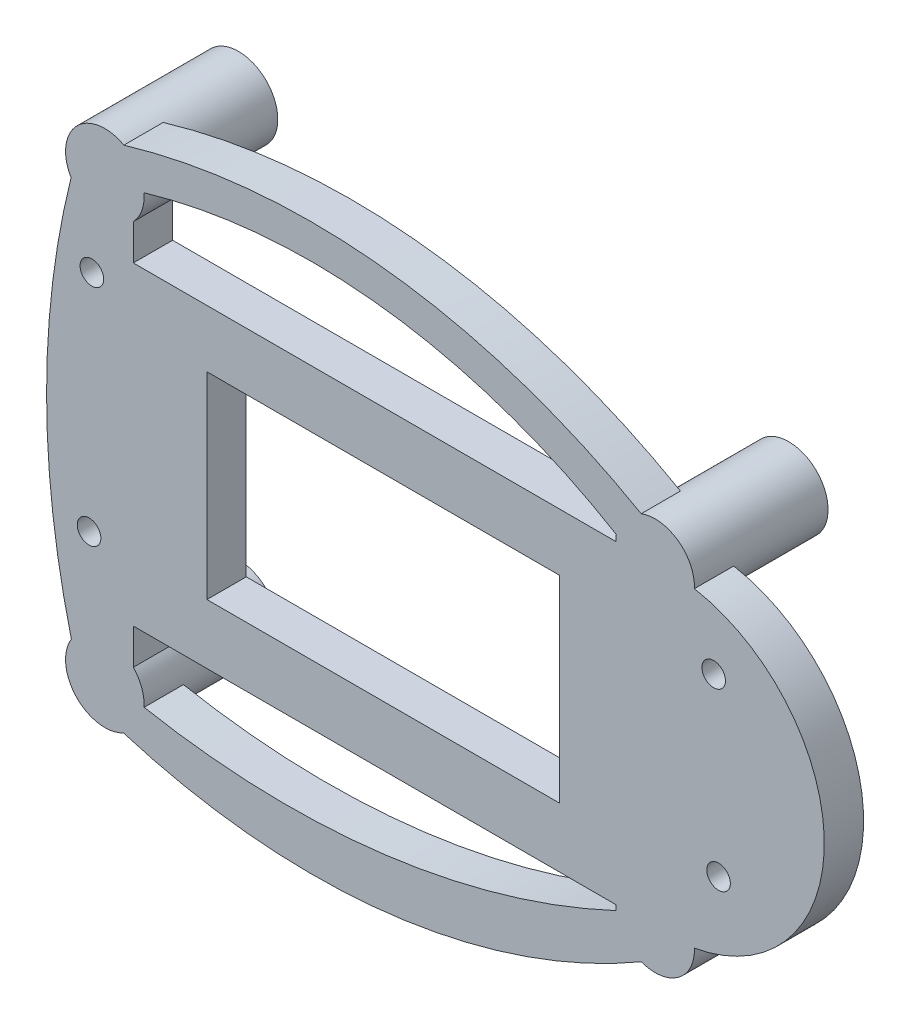
ISO-10303-21;
HEADER;
FILE_DESCRIPTION(('STEP AP214'),'2;1');
FILE_NAME('part.step','',(''),(''),'','','');
FILE_SCHEMA(('AUTOMOTIVE_DESIGN { 1 0 10303 214 1 1 1 1 }'));
ENDSEC;
DATA;
#1=APPLICATION_CONTEXT('core data for automotive mechanical design processes');
#2=APPLICATION_PROTOCOL_DEFINITION('international standard','automotive_design',2000,#1);
#3=PRODUCT_CONTEXT('',#1,'mechanical');
#4=PRODUCT('Part','Part','',(#3));
#5=PRODUCT_RELATED_PRODUCT_CATEGORY('part','',(#4));
#6=PRODUCT_DEFINITION_FORMATION('','',#4);
#7=PRODUCT_DEFINITION_CONTEXT('part definition',#1,'design');
#8=PRODUCT_DEFINITION('design','',#6,#7);
#9=PRODUCT_DEFINITION_SHAPE('','',#8);
#10=(LENGTH_UNIT() NAMED_UNIT(*) SI_UNIT(.MILLI.,.METRE.));
#11=(NAMED_UNIT(*) PLANE_ANGLE_UNIT() SI_UNIT($,.RADIAN.));
#12=(NAMED_UNIT(*) SI_UNIT($,.STERADIAN.) SOLID_ANGLE_UNIT());
#13=UNCERTAINTY_MEASURE_WITH_UNIT(LENGTH_MEASURE(1.E-05),#10,'distance_accuracy_value','');
#14=(GEOMETRIC_REPRESENTATION_CONTEXT(3) GLOBAL_UNCERTAINTY_ASSIGNED_CONTEXT((#13)) GLOBAL_UNIT_ASSIGNED_CONTEXT((#10,
#11,#12)) REPRESENTATION_CONTEXT('',''));
#15=CARTESIAN_POINT('',(0.,0.,0.));
#16=DIRECTION('',(0.,0.,1.));
#17=DIRECTION('',(1.,0.,0.));
#18=AXIS2_PLACEMENT_3D('',#15,#16,#17);
#19=CARTESIAN_POINT('',(-83.512307698448,-22.3019799287545,5.));
#20=DIRECTION('',(0.,0.,-1.));
#21=DIRECTION('',(-1.,0.,0.));
#22=AXIS2_PLACEMENT_3D('',#19,#20,#21);
#23=CYLINDRICAL_SURFACE('',#22,2.59999999999999);
#24=CARTESIAN_POINT('',(-83.512307698448,-22.3019799287545,-12.));
#25=DIRECTION('',(0.,0.,-1.));
#26=DIRECTION('',(-1.,0.,0.));
#27=AXIS2_PLACEMENT_3D('',#24,#25,#26);
#28=CIRCLE('',#27,2.59999999999999);
#29=CARTESIAN_POINT('',(-86.112307698448,-22.3019799287545,-12.));
#30=VERTEX_POINT('',#29);
#31=EDGE_CURVE('E238',#30,#30,#28,.T.);
#32=ORIENTED_EDGE('',*,*,#31,.T.);
#33=EDGE_LOOP('',(#32));
#34=FACE_BOUND('',#33,.T.);
#35=CARTESIAN_POINT('',(-83.512307698448,-22.3019799287545,-4.99999999999999));
#36=DIRECTION('',(0.,0.,1.));
#37=DIRECTION('',(1.,0.,0.));
#38=AXIS2_PLACEMENT_3D('',#35,#36,#37);
#39=CIRCLE('',#38,2.59999999999999);
#40=CARTESIAN_POINT('',(-80.912307698448,-22.3019799287545,-4.99999999999999));
#41=VERTEX_POINT('',#40);
#42=EDGE_CURVE('E587',#41,#41,#39,.T.);
#43=ORIENTED_EDGE('',*,*,#42,.T.);
#44=EDGE_LOOP('',(#43));
#45=FACE_BOUND('',#44,.T.);
#46=ADVANCED_FACE('F42',(#34,#45),#23,.F.);
#47=CARTESIAN_POINT('',(-13.512307698448,-14.3019799287545,5.));
#48=DIRECTION('',(0.,0.,-1.));
#49=DIRECTION('',(-1.,0.,0.));
#50=AXIS2_PLACEMENT_3D('',#47,#48,#49);
#51=CYLINDRICAL_SURFACE('',#50,2.6);
#52=CARTESIAN_POINT('',(-13.512307698448,-14.3019799287545,-12.));
#53=DIRECTION('',(0.,0.,-1.));
#54=DIRECTION('',(-1.,0.,0.));
#55=AXIS2_PLACEMENT_3D('',#52,#53,#54);
#56=CIRCLE('',#55,2.6);
#57=CARTESIAN_POINT('',(-16.112307698448,-14.3019799287545,-12.));
#58=VERTEX_POINT('',#57);
#59=EDGE_CURVE('E506',#58,#58,#56,.T.);
#60=ORIENTED_EDGE('',*,*,#59,.T.);
#61=EDGE_LOOP('',(#60));
#62=FACE_BOUND('',#61,.T.);
#63=CARTESIAN_POINT('',(-13.512307698448,-14.3019799287545,-4.99999999999999));
#64=DIRECTION('',(0.,0.,1.));
#65=DIRECTION('',(1.,0.,0.));
#66=AXIS2_PLACEMENT_3D('',#63,#64,#65);
#67=CIRCLE('',#66,2.6);
#68=CARTESIAN_POINT('',(-10.912307698448,-14.3019799287545,-4.99999999999999));
#69=VERTEX_POINT('',#68);
#70=EDGE_CURVE('E500',#69,#69,#67,.T.);
#71=ORIENTED_EDGE('',*,*,#70,.T.);
#72=EDGE_LOOP('',(#71));
#73=FACE_BOUND('',#72,.T.);
#74=ADVANCED_FACE('F611',(#62,#73),#51,.F.);
#75=CARTESIAN_POINT('',(-13.512307698448,25.6980200712455,5.));
#76=DIRECTION('',(0.,0.,-1.));
#77=DIRECTION('',(-1.,0.,0.));
#78=AXIS2_PLACEMENT_3D('',#75,#76,#77);
#79=CYLINDRICAL_SURFACE('',#78,2.6);
#80=CARTESIAN_POINT('',(-13.512307698448,25.6980200712455,-12.));
#81=DIRECTION('',(0.,0.,-1.));
#82=DIRECTION('',(-1.,0.,0.));
#83=AXIS2_PLACEMENT_3D('',#80,#81,#82);
#84=CIRCLE('',#83,2.6);
#85=CARTESIAN_POINT('',(-16.112307698448,25.6980200712455,-12.));
#86=VERTEX_POINT('',#85);
#87=EDGE_CURVE('E292',#86,#86,#84,.T.);
#88=ORIENTED_EDGE('',*,*,#87,.T.);
#89=EDGE_LOOP('',(#88));
#90=FACE_BOUND('',#89,.T.);
#91=CARTESIAN_POINT('',(-13.512307698448,25.6980200712455,-4.99999999999999));
#92=DIRECTION('',(0.,0.,1.));
#93=DIRECTION('',(1.,0.,0.));
#94=AXIS2_PLACEMENT_3D('',#91,#92,#93);
#95=CIRCLE('',#94,2.6);
#96=CARTESIAN_POINT('',(-10.912307698448,25.6980200712455,-4.99999999999999));
#97=VERTEX_POINT('',#96);
#98=EDGE_CURVE('E495',#97,#97,#95,.T.);
#99=ORIENTED_EDGE('',*,*,#98,.T.);
#100=EDGE_LOOP('',(#99));
#101=FACE_BOUND('',#100,.T.);
#102=ADVANCED_FACE('F617',(#90,#101),#79,.F.);
#103=CARTESIAN_POINT('',(-83.512307698448,33.6980200712455,5.));
#104=DIRECTION('',(0.,0.,-1.));
#105=DIRECTION('',(-1.,0.,0.));
#106=AXIS2_PLACEMENT_3D('',#103,#104,#105);
#107=CYLINDRICAL_SURFACE('',#106,2.59999999999999);
#108=CARTESIAN_POINT('',(-83.512307698448,33.6980200712455,-12.));
#109=DIRECTION('',(0.,0.,-1.));
#110=DIRECTION('',(-1.,0.,0.));
#111=AXIS2_PLACEMENT_3D('',#108,#109,#110);
#112=CIRCLE('',#111,2.59999999999999);
#113=CARTESIAN_POINT('',(-86.112307698448,33.6980200712455,-12.));
#114=VERTEX_POINT('',#113);
#115=EDGE_CURVE('E265',#114,#114,#112,.T.);
#116=ORIENTED_EDGE('',*,*,#115,.T.);
#117=EDGE_LOOP('',(#116));
#118=FACE_BOUND('',#117,.T.);
#119=CARTESIAN_POINT('',(-83.512307698448,33.6980200712455,-4.99999999999999));
#120=DIRECTION('',(0.,0.,1.));
#121=DIRECTION('',(1.,0.,0.));
#122=AXIS2_PLACEMENT_3D('',#119,#120,#121);
#123=CIRCLE('',#122,2.59999999999999);
#124=CARTESIAN_POINT('',(-80.912307698448,33.6980200712455,-4.99999999999999));
#125=VERTEX_POINT('',#124);
#126=EDGE_CURVE('E499',#125,#125,#123,.T.);
#127=ORIENTED_EDGE('',*,*,#126,.T.);
#128=EDGE_LOOP('',(#127));
#129=FACE_BOUND('',#128,.T.);
#130=ADVANCED_FACE('F622',(#118,#129),#107,.F.);
#131=CARTESIAN_POINT('',(-35.2783930265433,19.0750178271351,0.));
#132=DIRECTION('',(0.,0.,1.));
#133=DIRECTION('',(1.,0.,0.));
#134=AXIS2_PLACEMENT_3D('',#131,#132,#133);
#135=PLANE('',#134);
#136=CARTESIAN_POINT('',(-5.44529677776043,-4.69111653885912,0.));
#137=DIRECTION('',(0.,0.,1.));
#138=DIRECTION('',(1.,0.,0.));
#139=AXIS2_PLACEMENT_3D('',#136,#137,#138);
#140=CIRCLE('',#139,1.5);
#141=CARTESIAN_POINT('',(-3.94529677776043,-4.69111653885912,0.));
#142=VERTEX_POINT('',#141);
#143=EDGE_CURVE('E321',#142,#142,#140,.T.);
#144=ORIENTED_EDGE('',*,*,#143,.T.);
#145=EDGE_LOOP('',(#144));
#146=FACE_BOUND('',#145,.T.);
#147=CARTESIAN_POINT('',(-6.06421034522032,17.3148884735476,0.));
#148=DIRECTION('',(0.,0.,1.));
#149=DIRECTION('',(1.,0.,0.));
#150=AXIS2_PLACEMENT_3D('',#147,#148,#149);
#151=CIRCLE('',#150,1.5);
#152=CARTESIAN_POINT('',(-4.56421034522031,17.3148884735476,0.));
#153=VERTEX_POINT('',#152);
#154=EDGE_CURVE('E326',#153,#153,#151,.T.);
#155=ORIENTED_EDGE('',*,*,#154,.T.);
#156=EDGE_LOOP('',(#155));
#157=FACE_BOUND('',#156,.T.);
#158=CARTESIAN_POINT('',(-85.5239357137409,-6.70274455415199,0.));
#159=DIRECTION('',(0.,0.,1.));
#160=DIRECTION('',(1.,0.,0.));
#161=AXIS2_PLACEMENT_3D('',#158,#159,#160);
#162=CIRCLE('',#161,1.5);
#163=CARTESIAN_POINT('',(-84.0239357137409,-6.70274455415199,0.));
#164=VERTEX_POINT('',#163);
#165=EDGE_CURVE('E334',#164,#164,#162,.T.);
#166=ORIENTED_EDGE('',*,*,#165,.T.);
#167=EDGE_LOOP('',(#166));
#168=FACE_BOUND('',#167,.T.);
#169=CARTESIAN_POINT('',(-85.167222680251,22.0113146997251,0.));
#170=DIRECTION('',(0.,0.,1.));
#171=DIRECTION('',(1.,0.,0.));
#172=AXIS2_PLACEMENT_3D('',#169,#170,#171);
#173=CIRCLE('',#172,1.5);
#174=CARTESIAN_POINT('',(-83.667222680251,22.0113146997251,0.));
#175=VERTEX_POINT('',#174);
#176=EDGE_CURVE('E342',#175,#175,#173,.T.);
#177=ORIENTED_EDGE('',*,*,#176,.T.);
#178=EDGE_LOOP('',(#177));
#179=FACE_BOUND('',#178,.T.);
#180=DIRECTION('',(0.,-1.,0.));
#181=VECTOR('',#180,1.);
#182=CARTESIAN_POINT('',(-70.5265622200321,18.3949105439373,0.));
#183=LINE('',#182,#181);
#184=CARTESIAN_POINT('',(-70.5265622200321,18.3949105439373,0.));
#185=VERTEX_POINT('',#184);
#186=CARTESIAN_POINT('',(-70.5265622200321,-6.70274455415199,0.));
#187=VERTEX_POINT('',#186);
#188=EDGE_CURVE('E350',#185,#187,#183,.T.);
#189=ORIENTED_EDGE('',*,*,#188,.T.);
#190=DIRECTION('',(1.,0.,0.));
#191=VECTOR('',#190,1.);
#192=CARTESIAN_POINT('',(-70.5265622200321,-6.70274455415199,0.));
#193=LINE('',#192,#191);
#194=CARTESIAN_POINT('',(-25.7093209734441,-6.70274455415199,0.));
#195=VERTEX_POINT('',#194);
#196=EDGE_CURVE('E372',#187,#195,#193,.T.);
#197=ORIENTED_EDGE('',*,*,#196,.T.);
#198=DIRECTION('',(0.,1.,0.));
#199=VECTOR('',#198,1.);
#200=CARTESIAN_POINT('',(-25.7093209734441,18.3949105439373,0.));
#201=LINE('',#200,#199);
#202=CARTESIAN_POINT('',(-25.7093209734441,18.3949105439373,0.));
#203=VERTEX_POINT('',#202);
#204=EDGE_CURVE('E376',#195,#203,#201,.T.);
#205=ORIENTED_EDGE('',*,*,#204,.T.);
#206=DIRECTION('',(-1.,0.,0.));
#207=VECTOR('',#206,1.);
#208=CARTESIAN_POINT('',(-70.5265622200321,18.3949105439373,0.));
#209=LINE('',#208,#207);
#210=EDGE_CURVE('E358',#203,#185,#209,.T.);
#211=ORIENTED_EDGE('',*,*,#210,.T.);
#212=EDGE_LOOP('',(#189,#197,#205,#211));
#213=FACE_BOUND('',#212,.T.);
#214=CARTESIAN_POINT('',(-12.1154649233969,5.69802007124552,0.));
#215=DIRECTION('',(0.,0.,1.));
#216=DIRECTION('',(-1.,0.,0.));
#217=AXIS2_PLACEMENT_3D('',#214,#215,#216);
#218=CIRCLE('',#217,20.1231241484578);
#219=CARTESIAN_POINT('',(-8.51636347232125,-14.1006312524964,0.));
#220=VERTEX_POINT('',#219);
#221=CARTESIAN_POINT('',(-8.51636347232126,25.4966713949875,0.));
#222=VERTEX_POINT('',#221);
#223=EDGE_CURVE('E454',#220,#222,#218,.T.);
#224=ORIENTED_EDGE('',*,*,#223,.F.);
#225=CARTESIAN_POINT('',(-13.512307698448,-14.3019799287545,0.));
#226=DIRECTION('',(0.,0.,1.));
#227=DIRECTION('',(1.,0.,0.));
#228=AXIS2_PLACEMENT_3D('',#225,#226,#227);
#229=CIRCLE('',#228,5.);
#230=CARTESIAN_POINT('',(-18.512307698448,-14.3019803280735,0.));
#231=VERTEX_POINT('',#230);
#232=EDGE_CURVE('E218',#220,#231,#229,.T.);
#233=ORIENTED_EDGE('',*,*,#232,.T.);
#234=DIRECTION('',(-1.,0.,0.));
#235=VECTOR('',#234,1.);
#236=CARTESIAN_POINT('',(-79.8928256152222,-14.3019803280735,0.));
#237=LINE('',#236,#235);
#238=CARTESIAN_POINT('',(-79.8928256152222,-14.3019803280735,0.));
#239=VERTEX_POINT('',#238);
#240=EDGE_CURVE('E211',#231,#239,#237,.T.);
#241=ORIENTED_EDGE('',*,*,#240,.T.);
#242=DIRECTION('',(0.,-1.,0.));
#243=VECTOR('',#242,1.);
#244=CARTESIAN_POINT('',(-79.8928256152222,-14.3019803280735,0.));
#245=LINE('',#244,#243);
#246=CARTESIAN_POINT('',(-79.8928256152222,-18.8524365605378,0.));
#247=VERTEX_POINT('',#246);
#248=EDGE_CURVE('E422',#239,#247,#245,.T.);
#249=ORIENTED_EDGE('',*,*,#248,.T.);
#250=CARTESIAN_POINT('',(-83.512307698448,-22.3019799287545,0.));
#251=DIRECTION('',(0.,0.,1.));
#252=DIRECTION('',(1.,0.,0.));
#253=AXIS2_PLACEMENT_3D('',#250,#251,#252);
#254=CIRCLE('',#253,5.);
#255=CARTESIAN_POINT('',(-87.7725236195829,-19.6846224244559,0.));
#256=VERTEX_POINT('',#255);
#257=EDGE_CURVE('E251',#247,#256,#254,.T.);
#258=ORIENTED_EDGE('',*,*,#257,.T.);
#259=CARTESIAN_POINT('',(13.5483236221643,5.79442415203338,0.));
#260=DIRECTION('',(0.,0.,1.));
#261=DIRECTION('',(1.,0.,0.));
#262=AXIS2_PLACEMENT_3D('',#259,#260,#261);
#263=CIRCLE('',#262,104.47533632505);
#264=CARTESIAN_POINT('',(-87.8067094238595,31.1371386173743,0.));
#265=VERTEX_POINT('',#264);
#266=EDGE_CURVE('E441',#265,#256,#263,.T.);
#267=ORIENTED_EDGE('',*,*,#266,.F.);
#268=CARTESIAN_POINT('',(-83.512307698448,33.6980200712455,0.));
#269=DIRECTION('',(0.,0.,1.));
#270=DIRECTION('',(1.,0.,0.));
#271=AXIS2_PLACEMENT_3D('',#268,#269,#270);
#272=CIRCLE('',#271,5.00000000000001);
#273=CARTESIAN_POINT('',(-79.8928256152222,30.2484767030289,0.));
#274=VERTEX_POINT('',#273);
#275=EDGE_CURVE('E278',#265,#274,#272,.T.);
#276=ORIENTED_EDGE('',*,*,#275,.T.);
#277=DIRECTION('',(0.,-1.,0.));
#278=VECTOR('',#277,1.);
#279=CARTESIAN_POINT('',(-79.8928256152222,33.6980198675562,0.));
#280=LINE('',#279,#278);
#281=CARTESIAN_POINT('',(-79.8928256152222,25.6980200712455,0.));
#282=VERTEX_POINT('',#281);
#283=EDGE_CURVE('E411',#274,#282,#280,.T.);
#284=ORIENTED_EDGE('',*,*,#283,.T.);
#285=DIRECTION('',(1.,0.,0.));
#286=VECTOR('',#285,1.);
#287=CARTESIAN_POINT('',(-79.8928256152222,25.6980200712455,0.));
#288=LINE('',#287,#286);
#289=CARTESIAN_POINT('',(-18.512307698448,25.6980200712455,0.));
#290=VERTEX_POINT('',#289);
#291=EDGE_CURVE('E401',#282,#290,#288,.T.);
#292=ORIENTED_EDGE('',*,*,#291,.T.);
#293=CARTESIAN_POINT('',(-13.512307698448,25.6980200712455,0.));
#294=DIRECTION('',(0.,0.,1.));
#295=DIRECTION('',(1.,0.,0.));
#296=AXIS2_PLACEMENT_3D('',#293,#294,#295);
#297=CIRCLE('',#296,5.);
#298=EDGE_CURVE('E305',#290,#222,#297,.T.);
#299=ORIENTED_EDGE('',*,*,#298,.T.);
#300=EDGE_LOOP('',(#224,#233,#241,#249,#258,#267,#276,#284,#292,#299));
#301=FACE_BOUND('',#300,.T.);
#302=ADVANCED_FACE('F630',(#146,#157,#168,#179,#213,#301),#135,.F.);
#303=CARTESIAN_POINT('',(-57.1828732053487,-38.3236908219769,0.));
#304=DIRECTION('',(0.,0.,1.));
#305=DIRECTION('',(-1.,0.,0.));
#306=AXIS2_PLACEMENT_3D('',#303,#304,#305);
#307=CIRCLE('',#306,75.5173407179141);
#308=CARTESIAN_POINT('',(-18.4471890489969,26.5023496405169,0.));
#309=VERTEX_POINT('',#308);
#310=CARTESIAN_POINT('',(-78.5296220934509,34.1137653800035,0.));
#311=VERTEX_POINT('',#310);
#312=EDGE_CURVE('E396',#309,#311,#307,.T.);
#313=ORIENTED_EDGE('',*,*,#312,.T.);
#314=CARTESIAN_POINT('',(-81.0963866501547,38.075613644022,0.));
#315=VERTEX_POINT('',#314);
#316=EDGE_CURVE('E282',#311,#315,#272,.T.);
#317=ORIENTED_EDGE('',*,*,#316,.T.);
#318=CARTESIAN_POINT('',(-57.1669271877249,-42.410418712094,0.));
#319=DIRECTION('',(0.,0.,1.));
#320=DIRECTION('',(1.,0.,0.));
#321=AXIS2_PLACEMENT_3D('',#318,#319,#320);
#322=CIRCLE('',#321,83.9679726716908);
#323=CARTESIAN_POINT('',(-15.2917196693426,30.3706738180833,0.));
#324=VERTEX_POINT('',#323);
#325=EDGE_CURVE('E457',#324,#315,#322,.T.);
#326=ORIENTED_EDGE('',*,*,#325,.F.);
#327=EDGE_CURVE('E310',#324,#309,#297,.T.);
#328=ORIENTED_EDGE('',*,*,#327,.T.);
#329=EDGE_LOOP('',(#313,#317,#326,#328));
#330=FACE_BOUND('',#329,.T.);
#331=ADVANCED_FACE('F627',(#330),#135,.F.);
#332=CARTESIAN_POINT('',(-35.2783930265433,19.0750178271351,5.));
#333=DIRECTION('',(0.,0.,1.));
#334=DIRECTION('',(1.,0.,0.));
#335=AXIS2_PLACEMENT_3D('',#332,#333,#334);
#336=PLANE('',#335);
#337=DIRECTION('',(-1.,0.,0.));
#338=VECTOR('',#337,1.);
#339=CARTESIAN_POINT('',(-79.8928256152222,-14.3019803280735,5.));
#340=LINE('',#339,#338);
#341=CARTESIAN_POINT('',(-18.512307698448,-14.3019803280735,5.));
#342=VERTEX_POINT('',#341);
#343=CARTESIAN_POINT('',(-79.8928256152222,-14.3019803280735,5.));
#344=VERTEX_POINT('',#343);
#345=EDGE_CURVE('E194',#342,#344,#340,.T.);
#346=ORIENTED_EDGE('',*,*,#345,.F.);
#347=CARTESIAN_POINT('',(-13.512307698448,-14.3019799287545,5.));
#348=DIRECTION('',(0.,0.,1.));
#349=DIRECTION('',(1.,0.,0.));
#350=AXIS2_PLACEMENT_3D('',#347,#348,#349);
#351=CIRCLE('',#350,5.);
#352=CARTESIAN_POINT('',(-18.4709602588486,-14.9436689385034,5.));
#353=VERTEX_POINT('',#352);
#354=EDGE_CURVE('E200',#353,#342,#351,.F.);
#355=ORIENTED_EDGE('',*,*,#354,.F.);
#356=CARTESIAN_POINT('',(-60.2818658125429,74.0317317983794,5.));
#357=DIRECTION('',(0.,0.,1.));
#358=DIRECTION('',(1.,0.,0.));
#359=AXIS2_PLACEMENT_3D('',#356,#357,#358);
#360=CIRCLE('',#359,98.309581219273);
#361=CARTESIAN_POINT('',(-78.5195702466896,-22.5713732059709,5.));
#362=VERTEX_POINT('',#361);
#363=EDGE_CURVE('E207',#362,#353,#360,.T.);
#364=ORIENTED_EDGE('',*,*,#363,.F.);
#365=CARTESIAN_POINT('',(-83.512307698448,-22.3019799287545,5.));
#366=DIRECTION('',(0.,0.,1.));
#367=DIRECTION('',(1.,0.,0.));
#368=AXIS2_PLACEMENT_3D('',#365,#366,#367);
#369=CIRCLE('',#368,5.);
#370=CARTESIAN_POINT('',(-79.8928256152222,-18.8524365605378,5.));
#371=VERTEX_POINT('',#370);
#372=EDGE_CURVE('E246',#371,#362,#369,.F.);
#373=ORIENTED_EDGE('',*,*,#372,.F.);
#374=DIRECTION('',(0.,-1.,0.));
#375=VECTOR('',#374,1.);
#376=CARTESIAN_POINT('',(-79.8928256152222,-14.3019803280735,5.));
#377=LINE('',#376,#375);
#378=EDGE_CURVE('E202',#344,#371,#377,.T.);
#379=ORIENTED_EDGE('',*,*,#378,.F.);
#380=EDGE_LOOP('',(#346,#355,#364,#373,#379));
#381=FACE_BOUND('',#380,.T.);
#382=CARTESIAN_POINT('',(-8.51636347232126,-14.1006312524964,5.));
#383=VERTEX_POINT('',#382);
#384=CARTESIAN_POINT('',(-15.2741554998542,-18.981284612645,5.));
#385=VERTEX_POINT('',#384);
#386=EDGE_CURVE('E219',#383,#385,#351,.F.);
#387=ORIENTED_EDGE('',*,*,#386,.F.);
#388=CARTESIAN_POINT('',(-12.1154649233969,5.69802007124552,5.));
#389=DIRECTION('',(0.,0.,1.));
#390=DIRECTION('',(-1.,0.,0.));
#391=AXIS2_PLACEMENT_3D('',#388,#389,#390);
#392=CIRCLE('',#391,20.1231241484578);
#393=CARTESIAN_POINT('',(-8.51636347232126,25.4966713949875,5.));
#394=VERTEX_POINT('',#393);
#395=EDGE_CURVE('E440',#383,#394,#392,.T.);
#396=ORIENTED_EDGE('',*,*,#395,.T.);
#397=CARTESIAN_POINT('',(-13.512307698448,25.6980200712455,5.));
#398=DIRECTION('',(0.,0.,1.));
#399=DIRECTION('',(1.,0.,0.));
#400=AXIS2_PLACEMENT_3D('',#397,#398,#399);
#401=CIRCLE('',#400,5.);
#402=CARTESIAN_POINT('',(-15.2917196693426,30.3706738180833,5.));
#403=VERTEX_POINT('',#402);
#404=EDGE_CURVE('E300',#403,#394,#401,.F.);
#405=ORIENTED_EDGE('',*,*,#404,.F.);
#406=CARTESIAN_POINT('',(-57.1669271877249,-42.410418712094,5.));
#407=DIRECTION('',(0.,0.,1.));
#408=DIRECTION('',(1.,0.,0.));
#409=AXIS2_PLACEMENT_3D('',#406,#407,#408);
#410=CIRCLE('',#409,83.9679726716908);
#411=CARTESIAN_POINT('',(-81.0963866501547,38.075613644022,5.));
#412=VERTEX_POINT('',#411);
#413=EDGE_CURVE('E444',#403,#412,#410,.T.);
#414=ORIENTED_EDGE('',*,*,#413,.T.);
#415=CARTESIAN_POINT('',(-83.512307698448,33.6980200712455,5.));
#416=DIRECTION('',(0.,0.,1.));
#417=DIRECTION('',(1.,0.,0.));
#418=AXIS2_PLACEMENT_3D('',#415,#416,#417);
#419=CIRCLE('',#418,5.00000000000001);
#420=CARTESIAN_POINT('',(-87.8067094238596,31.1371386173742,5.));
#421=VERTEX_POINT('',#420);
#422=EDGE_CURVE('E277',#421,#412,#419,.F.);
#423=ORIENTED_EDGE('',*,*,#422,.F.);
#424=CARTESIAN_POINT('',(13.5483236221643,5.79442415203338,5.));
#425=DIRECTION('',(0.,0.,1.));
#426=DIRECTION('',(1.,0.,0.));
#427=AXIS2_PLACEMENT_3D('',#424,#425,#426);
#428=CIRCLE('',#427,104.47533632505);
#429=CARTESIAN_POINT('',(-87.7725236195829,-19.6846224244558,5.));
#430=VERTEX_POINT('',#429);
#431=EDGE_CURVE('E448',#421,#430,#428,.T.);
#432=ORIENTED_EDGE('',*,*,#431,.T.);
#433=CARTESIAN_POINT('',(-81.149815341354,-26.7086373766023,5.));
#434=VERTEX_POINT('',#433);
#435=EDGE_CURVE('E250',#434,#430,#369,.F.);
#436=ORIENTED_EDGE('',*,*,#435,.F.);
#437=CARTESIAN_POINT('',(-57.0444783546386,52.4520155830246,5.));
#438=DIRECTION('',(0.,0.,1.));
#439=DIRECTION('',(1.,0.,0.));
#440=AXIS2_PLACEMENT_3D('',#437,#438,#439);
#441=CIRCLE('',#440,82.7494788396736);
#442=EDGE_CURVE('E437',#434,#385,#441,.T.);
#443=ORIENTED_EDGE('',*,*,#442,.T.);
#444=EDGE_LOOP('',(#387,#396,#405,#414,#423,#432,#436,#443));
#445=FACE_BOUND('',#444,.T.);
#446=CARTESIAN_POINT('',(-78.5296220934509,34.1137653800035,5.));
#447=VERTEX_POINT('',#446);
#448=CARTESIAN_POINT('',(-79.8928256152222,30.2484767030289,5.));
#449=VERTEX_POINT('',#448);
#450=EDGE_CURVE('E273',#447,#449,#419,.F.);
#451=ORIENTED_EDGE('',*,*,#450,.F.);
#452=CARTESIAN_POINT('',(-57.1828732053487,-38.3236908219769,5.));
#453=DIRECTION('',(0.,0.,1.));
#454=DIRECTION('',(-1.,0.,0.));
#455=AXIS2_PLACEMENT_3D('',#452,#453,#454);
#456=CIRCLE('',#455,75.5173407179141);
#457=CARTESIAN_POINT('',(-18.447189048997,26.5023496405169,5.));
#458=VERTEX_POINT('',#457);
#459=EDGE_CURVE('E397',#458,#447,#456,.T.);
#460=ORIENTED_EDGE('',*,*,#459,.F.);
#461=CARTESIAN_POINT('',(-18.512307698448,25.6980200712455,5.));
#462=VERTEX_POINT('',#461);
#463=EDGE_CURVE('E304',#462,#458,#401,.F.);
#464=ORIENTED_EDGE('',*,*,#463,.F.);
#465=DIRECTION('',(1.,0.,0.));
#466=VECTOR('',#465,1.);
#467=CARTESIAN_POINT('',(-79.8928256152222,25.6980200712455,5.));
#468=LINE('',#467,#466);
#469=CARTESIAN_POINT('',(-79.8928256152222,25.6980200712455,5.));
#470=VERTEX_POINT('',#469);
#471=EDGE_CURVE('E404',#470,#462,#468,.T.);
#472=ORIENTED_EDGE('',*,*,#471,.F.);
#473=DIRECTION('',(0.,-1.,0.));
#474=VECTOR('',#473,1.);
#475=CARTESIAN_POINT('',(-79.8928256152222,33.6980198675562,5.));
#476=LINE('',#475,#474);
#477=EDGE_CURVE('E400',#449,#470,#476,.T.);
#478=ORIENTED_EDGE('',*,*,#477,.F.);
#479=EDGE_LOOP('',(#451,#460,#464,#472,#478));
#480=FACE_BOUND('',#479,.T.);
#481=CARTESIAN_POINT('',(-6.06421034522032,17.3148884735476,5.));
#482=DIRECTION('',(0.,0.,1.));
#483=DIRECTION('',(1.,0.,0.));
#484=AXIS2_PLACEMENT_3D('',#481,#482,#483);
#485=CIRCLE('',#484,1.5);
#486=CARTESIAN_POINT('',(-4.56421034522031,17.3148884735476,5.));
#487=VERTEX_POINT('',#486);
#488=EDGE_CURVE('E330',#487,#487,#485,.T.);
#489=ORIENTED_EDGE('',*,*,#488,.F.);
#490=EDGE_LOOP('',(#489));
#491=FACE_BOUND('',#490,.T.);
#492=CARTESIAN_POINT('',(-85.167222680251,22.0113146997251,5.));
#493=DIRECTION('',(0.,0.,1.));
#494=DIRECTION('',(1.,0.,0.));
#495=AXIS2_PLACEMENT_3D('',#492,#493,#494);
#496=CIRCLE('',#495,1.5);
#497=CARTESIAN_POINT('',(-83.667222680251,22.0113146997251,5.));
#498=VERTEX_POINT('',#497);
#499=EDGE_CURVE('E346',#498,#498,#496,.T.);
#500=ORIENTED_EDGE('',*,*,#499,.F.);
#501=EDGE_LOOP('',(#500));
#502=FACE_BOUND('',#501,.T.);
#503=DIRECTION('',(1.,0.,0.));
#504=VECTOR('',#503,1.);
#505=CARTESIAN_POINT('',(-70.5265622200321,-6.70274455415199,5.));
#506=LINE('',#505,#504);
#507=CARTESIAN_POINT('',(-70.5265622200321,-6.70274455415199,5.));
#508=VERTEX_POINT('',#507);
#509=CARTESIAN_POINT('',(-25.7093209734441,-6.70274455415199,5.));
#510=VERTEX_POINT('',#509);
#511=EDGE_CURVE('E357',#508,#510,#506,.T.);
#512=ORIENTED_EDGE('',*,*,#511,.F.);
#513=DIRECTION('',(0.,-1.,0.));
#514=VECTOR('',#513,1.);
#515=CARTESIAN_POINT('',(-70.5265622200321,18.3949105439373,5.));
#516=LINE('',#515,#514);
#517=CARTESIAN_POINT('',(-70.5265622200321,18.3949105439373,5.));
#518=VERTEX_POINT('',#517);
#519=EDGE_CURVE('E354',#518,#508,#516,.T.);
#520=ORIENTED_EDGE('',*,*,#519,.F.);
#521=DIRECTION('',(-1.,0.,0.));
#522=VECTOR('',#521,1.);
#523=CARTESIAN_POINT('',(-70.5265622200321,18.3949105439373,5.));
#524=LINE('',#523,#522);
#525=CARTESIAN_POINT('',(-25.7093209734441,18.3949105439373,5.));
#526=VERTEX_POINT('',#525);
#527=EDGE_CURVE('E365',#526,#518,#524,.T.);
#528=ORIENTED_EDGE('',*,*,#527,.F.);
#529=DIRECTION('',(0.,1.,0.));
#530=VECTOR('',#529,1.);
#531=CARTESIAN_POINT('',(-25.7093209734441,18.3949105439373,5.));
#532=LINE('',#531,#530);
#533=EDGE_CURVE('E361',#510,#526,#532,.T.);
#534=ORIENTED_EDGE('',*,*,#533,.F.);
#535=EDGE_LOOP('',(#512,#520,#528,#534));
#536=FACE_BOUND('',#535,.T.);
#537=CARTESIAN_POINT('',(-85.5239357137409,-6.70274455415199,5.));
#538=DIRECTION('',(0.,0.,1.));
#539=DIRECTION('',(1.,0.,0.));
#540=AXIS2_PLACEMENT_3D('',#537,#538,#539);
#541=CIRCLE('',#540,1.5);
#542=CARTESIAN_POINT('',(-84.0239357137409,-6.70274455415199,5.));
#543=VERTEX_POINT('',#542);
#544=EDGE_CURVE('E338',#543,#543,#541,.T.);
#545=ORIENTED_EDGE('',*,*,#544,.F.);
#546=EDGE_LOOP('',(#545));
#547=FACE_BOUND('',#546,.T.);
#548=CARTESIAN_POINT('',(-5.44529677776043,-4.69111653885912,5.));
#549=DIRECTION('',(0.,0.,1.));
#550=DIRECTION('',(1.,0.,0.));
#551=AXIS2_PLACEMENT_3D('',#548,#549,#550);
#552=CIRCLE('',#551,1.5);
#553=CARTESIAN_POINT('',(-3.94529677776043,-4.69111653885912,5.));
#554=VERTEX_POINT('',#553);
#555=EDGE_CURVE('E322',#554,#554,#552,.T.);
#556=ORIENTED_EDGE('',*,*,#555,.F.);
#557=EDGE_LOOP('',(#556));
#558=FACE_BOUND('',#557,.T.);
#559=ADVANCED_FACE('F196',(#381,#445,#480,#491,#502,#536,#547,#558),#336,.T.);
#560=CARTESIAN_POINT('',(-60.2818658125429,74.0317317983794,0.));
#561=DIRECTION('',(0.,0.,1.));
#562=DIRECTION('',(1.,0.,0.));
#563=AXIS2_PLACEMENT_3D('',#560,#561,#562);
#564=CIRCLE('',#563,98.309581219273);
#565=CARTESIAN_POINT('',(-78.5195702466896,-22.5713732059709,0.));
#566=VERTEX_POINT('',#565);
#567=CARTESIAN_POINT('',(-18.4709602588486,-14.9436689385034,0.));
#568=VERTEX_POINT('',#567);
#569=EDGE_CURVE('E420',#566,#568,#564,.T.);
#570=ORIENTED_EDGE('',*,*,#569,.T.);
#571=CARTESIAN_POINT('',(-15.2741554998541,-18.981284612645,0.));
#572=VERTEX_POINT('',#571);
#573=EDGE_CURVE('E58',#568,#572,#229,.T.);
#574=ORIENTED_EDGE('',*,*,#573,.T.);
#575=CARTESIAN_POINT('',(-57.0444783546386,52.4520155830246,0.));
#576=DIRECTION('',(0.,0.,1.));
#577=DIRECTION('',(1.,0.,0.));
#578=AXIS2_PLACEMENT_3D('',#575,#576,#577);
#579=CIRCLE('',#578,82.7494788396736);
#580=CARTESIAN_POINT('',(-81.149815341354,-26.7086373766023,0.));
#581=VERTEX_POINT('',#580);
#582=EDGE_CURVE('E436',#581,#572,#579,.T.);
#583=ORIENTED_EDGE('',*,*,#582,.F.);
#584=EDGE_CURVE('E255',#581,#566,#254,.T.);
#585=ORIENTED_EDGE('',*,*,#584,.T.);
#586=EDGE_LOOP('',(#570,#574,#583,#585));
#587=FACE_BOUND('',#586,.T.);
#588=ADVANCED_FACE('F626',(#587),#135,.F.);
#589=CARTESIAN_POINT('',(-57.0444783546386,52.4520155830246,5.));
#590=DIRECTION('',(0.,0.,-1.));
#591=DIRECTION('',(-1.,0.,0.));
#592=AXIS2_PLACEMENT_3D('',#589,#590,#591);
#593=CYLINDRICAL_SURFACE('',#592,82.7494788396736);
#594=ORIENTED_EDGE('',*,*,#582,.T.);
#595=DIRECTION('',(0.,0.,-1.));
#596=VECTOR('',#595,1.);
#597=CARTESIAN_POINT('',(-15.2741554998542,-18.981284612645,-3.5));
#598=LINE('',#597,#596);
#599=EDGE_CURVE('E65',#572,#385,#598,.F.);
#600=ORIENTED_EDGE('',*,*,#599,.T.);
#601=ORIENTED_EDGE('',*,*,#442,.F.);
#602=DIRECTION('',(0.,0.,-1.));
#603=VECTOR('',#602,1.);
#604=CARTESIAN_POINT('',(-81.149815341354,-26.7086373766023,-3.5));
#605=LINE('',#604,#603);
#606=EDGE_CURVE('E262',#434,#581,#605,.T.);
#607=ORIENTED_EDGE('',*,*,#606,.T.);
#608=EDGE_LOOP('',(#594,#600,#601,#607));
#609=FACE_BOUND('',#608,.T.);
#610=ADVANCED_FACE('F44',(#609),#593,.T.);
#611=CARTESIAN_POINT('',(-12.1154649233969,5.69802007124552,5.));
#612=DIRECTION('',(0.,0.,-1.));
#613=DIRECTION('',(-1.,0.,0.));
#614=AXIS2_PLACEMENT_3D('',#611,#612,#613);
#615=CYLINDRICAL_SURFACE('',#614,20.1231241484578);
#616=ORIENTED_EDGE('',*,*,#395,.F.);
#617=DIRECTION('',(0.,0.,-1.));
#618=VECTOR('',#617,1.);
#619=CARTESIAN_POINT('',(-8.51636347232126,-14.1006312524964,-3.5));
#620=LINE('',#619,#618);
#621=EDGE_CURVE('E224',#383,#220,#620,.T.);
#622=ORIENTED_EDGE('',*,*,#621,.T.);
#623=ORIENTED_EDGE('',*,*,#223,.T.);
#624=DIRECTION('',(0.,0.,-1.));
#625=VECTOR('',#624,1.);
#626=CARTESIAN_POINT('',(-8.51636347232126,25.4966713949875,-3.5));
#627=LINE('',#626,#625);
#628=EDGE_CURVE('E309',#222,#394,#627,.F.);
#629=ORIENTED_EDGE('',*,*,#628,.T.);
#630=EDGE_LOOP('',(#616,#622,#623,#629));
#631=FACE_BOUND('',#630,.T.);
#632=ADVANCED_FACE('F637',(#631),#615,.T.);
#633=CARTESIAN_POINT('',(-57.1669271877249,-42.410418712094,5.));
#634=DIRECTION('',(0.,0.,-1.));
#635=DIRECTION('',(-1.,0.,0.));
#636=AXIS2_PLACEMENT_3D('',#633,#634,#635);
#637=CYLINDRICAL_SURFACE('',#636,83.9679726716908);
#638=ORIENTED_EDGE('',*,*,#325,.T.);
#639=DIRECTION('',(0.,0.,-1.));
#640=VECTOR('',#639,1.);
#641=CARTESIAN_POINT('',(-81.0963866501547,38.075613644022,-3.5));
#642=LINE('',#641,#640);
#643=EDGE_CURVE('E289',#315,#412,#642,.F.);
#644=ORIENTED_EDGE('',*,*,#643,.T.);
#645=ORIENTED_EDGE('',*,*,#413,.F.);
#646=DIRECTION('',(0.,0.,-1.));
#647=VECTOR('',#646,1.);
#648=CARTESIAN_POINT('',(-15.2917196693426,30.3706738180833,-3.5));
#649=LINE('',#648,#647);
#650=EDGE_CURVE('E318',#403,#324,#649,.T.);
#651=ORIENTED_EDGE('',*,*,#650,.T.);
#652=EDGE_LOOP('',(#638,#644,#645,#651));
#653=FACE_BOUND('',#652,.T.);
#654=ADVANCED_FACE('F634',(#653),#637,.T.);
#655=CARTESIAN_POINT('',(13.5483236221643,5.79442415203338,5.));
#656=DIRECTION('',(0.,0.,-1.));
#657=DIRECTION('',(-1.,0.,0.));
#658=AXIS2_PLACEMENT_3D('',#655,#656,#657);
#659=CYLINDRICAL_SURFACE('',#658,104.47533632505);
#660=ORIENTED_EDGE('',*,*,#266,.T.);
#661=DIRECTION('',(0.,0.,-1.));
#662=VECTOR('',#661,1.);
#663=CARTESIAN_POINT('',(-87.772523619583,-19.6846224244559,-3.5));
#664=LINE('',#663,#662);
#665=EDGE_CURVE('E254',#256,#430,#664,.F.);
#666=ORIENTED_EDGE('',*,*,#665,.T.);
#667=ORIENTED_EDGE('',*,*,#431,.F.);
#668=DIRECTION('',(0.,0.,-1.));
#669=VECTOR('',#668,1.);
#670=CARTESIAN_POINT('',(-87.8067094238596,31.1371386173743,-3.5));
#671=LINE('',#670,#669);
#672=EDGE_CURVE('E281',#421,#265,#671,.T.);
#673=ORIENTED_EDGE('',*,*,#672,.T.);
#674=EDGE_LOOP('',(#660,#666,#667,#673));
#675=FACE_BOUND('',#674,.T.);
#676=ADVANCED_FACE('F631',(#675),#659,.T.);
#677=CARTESIAN_POINT('',(-60.2818658125429,74.0317317983794,5.));
#678=DIRECTION('',(0.,0.,-1.));
#679=DIRECTION('',(-1.,0.,0.));
#680=AXIS2_PLACEMENT_3D('',#677,#678,#679);
#681=CYLINDRICAL_SURFACE('',#680,98.309581219273);
#682=DIRECTION('',(0.,0.,-1.));
#683=VECTOR('',#682,1.);
#684=CARTESIAN_POINT('',(-18.4709602588486,-14.9436689385034,-3.5));
#685=LINE('',#684,#683);
#686=EDGE_CURVE('E216',#568,#353,#685,.F.);
#687=ORIENTED_EDGE('',*,*,#686,.F.);
#688=ORIENTED_EDGE('',*,*,#569,.F.);
#689=DIRECTION('',(0.,0.,-1.));
#690=VECTOR('',#689,1.);
#691=CARTESIAN_POINT('',(-78.5195702466896,-22.5713732059709,-3.5));
#692=LINE('',#691,#690);
#693=EDGE_CURVE('E258',#362,#566,#692,.T.);
#694=ORIENTED_EDGE('',*,*,#693,.F.);
#695=ORIENTED_EDGE('',*,*,#363,.T.);
#696=EDGE_LOOP('',(#687,#688,#694,#695));
#697=FACE_BOUND('',#696,.T.);
#698=ADVANCED_FACE('F481',(#697),#681,.F.);
#699=CARTESIAN_POINT('',(-79.8928256152222,-14.3019803280735,5.));
#700=DIRECTION('',(0.,-1.,0.));
#701=DIRECTION('',(0.,0.,-1.));
#702=AXIS2_PLACEMENT_3D('',#699,#700,#701);
#703=PLANE('',#702);
#704=DIRECTION('',(0.,0.,-1.));
#705=VECTOR('',#704,1.);
#706=CARTESIAN_POINT('',(-18.512307698448,-14.3019803280735,19.142135623731));
#707=LINE('',#706,#705);
#708=EDGE_CURVE('E11',#342,#231,#707,.T.);
#709=ORIENTED_EDGE('',*,*,#708,.F.);
#710=ORIENTED_EDGE('',*,*,#345,.T.);
#711=DIRECTION('',(0.,0.,-1.));
#712=VECTOR('',#711,1.);
#713=CARTESIAN_POINT('',(-79.8928256152222,-14.3019803280735,5.));
#714=LINE('',#713,#712);
#715=EDGE_CURVE('E426',#344,#239,#714,.T.);
#716=ORIENTED_EDGE('',*,*,#715,.T.);
#717=ORIENTED_EDGE('',*,*,#240,.F.);
#718=EDGE_LOOP('',(#709,#710,#716,#717));
#719=FACE_BOUND('',#718,.T.);
#720=ADVANCED_FACE('F210',(#719),#703,.T.);
#721=CARTESIAN_POINT('',(-79.8928256152222,-14.3019803280735,5.));
#722=DIRECTION('',(1.,0.,0.));
#723=DIRECTION('',(0.,0.,-1.));
#724=AXIS2_PLACEMENT_3D('',#721,#722,#723);
#725=PLANE('',#724);
#726=DIRECTION('',(0.,0.,-1.));
#727=VECTOR('',#726,1.);
#728=CARTESIAN_POINT('',(-79.8928256152222,-18.8524365605378,19.142135623731));
#729=LINE('',#728,#727);
#730=EDGE_CURVE('E51',#247,#371,#729,.F.);
#731=ORIENTED_EDGE('',*,*,#730,.F.);
#732=ORIENTED_EDGE('',*,*,#248,.F.);
#733=ORIENTED_EDGE('',*,*,#715,.F.);
#734=ORIENTED_EDGE('',*,*,#378,.T.);
#735=EDGE_LOOP('',(#731,#732,#733,#734));
#736=FACE_BOUND('',#735,.T.);
#737=ADVANCED_FACE('F698',(#736),#725,.T.);
#738=CARTESIAN_POINT('',(-57.1828732053487,-38.3236908219769,5.));
#739=DIRECTION('',(0.,0.,-1.));
#740=DIRECTION('',(-1.,0.,0.));
#741=AXIS2_PLACEMENT_3D('',#738,#739,#740);
#742=CYLINDRICAL_SURFACE('',#741,75.5173407179141);
#743=DIRECTION('',(0.,0.,-1.));
#744=VECTOR('',#743,1.);
#745=CARTESIAN_POINT('',(-78.5296220934509,34.1137653800035,-3.5));
#746=LINE('',#745,#744);
#747=EDGE_CURVE('E285',#311,#447,#746,.F.);
#748=ORIENTED_EDGE('',*,*,#747,.F.);
#749=ORIENTED_EDGE('',*,*,#312,.F.);
#750=DIRECTION('',(0.,0.,-1.));
#751=VECTOR('',#750,1.);
#752=CARTESIAN_POINT('',(-18.447189048997,26.5023496405168,-3.5));
#753=LINE('',#752,#751);
#754=EDGE_CURVE('E314',#458,#309,#753,.T.);
#755=ORIENTED_EDGE('',*,*,#754,.F.);
#756=ORIENTED_EDGE('',*,*,#459,.T.);
#757=EDGE_LOOP('',(#748,#749,#755,#756));
#758=FACE_BOUND('',#757,.T.);
#759=ADVANCED_FACE('F679',(#758),#742,.F.);
#760=CARTESIAN_POINT('',(-79.8928256152222,33.6980198675562,5.));
#761=DIRECTION('',(1.,0.,0.));
#762=DIRECTION('',(0.,0.,-1.));
#763=AXIS2_PLACEMENT_3D('',#760,#761,#762);
#764=PLANE('',#763);
#765=DIRECTION('',(0.,0.,-1.));
#766=VECTOR('',#765,1.);
#767=CARTESIAN_POINT('',(-79.8928256152222,30.2484767030289,19.142135623731));
#768=LINE('',#767,#766);
#769=EDGE_CURVE('E467',#449,#274,#768,.T.);
#770=ORIENTED_EDGE('',*,*,#769,.F.);
#771=ORIENTED_EDGE('',*,*,#477,.T.);
#772=DIRECTION('',(0.,0.,-1.));
#773=VECTOR('',#772,1.);
#774=CARTESIAN_POINT('',(-79.8928256152222,25.6980200712455,5.));
#775=LINE('',#774,#773);
#776=EDGE_CURVE('E407',#470,#282,#775,.T.);
#777=ORIENTED_EDGE('',*,*,#776,.T.);
#778=ORIENTED_EDGE('',*,*,#283,.F.);
#779=EDGE_LOOP('',(#770,#771,#777,#778));
#780=FACE_BOUND('',#779,.T.);
#781=ADVANCED_FACE('F663',(#780),#764,.T.);
#782=CARTESIAN_POINT('',(-79.8928256152222,25.6980200712455,5.));
#783=DIRECTION('',(0.,1.,0.));
#784=DIRECTION('',(0.,0.,1.));
#785=AXIS2_PLACEMENT_3D('',#782,#783,#784);
#786=PLANE('',#785);
#787=DIRECTION('',(0.,0.,-1.));
#788=VECTOR('',#787,1.);
#789=CARTESIAN_POINT('',(-18.512307698448,25.6980200712455,19.142135623731));
#790=LINE('',#789,#788);
#791=EDGE_CURVE('E451',#290,#462,#790,.F.);
#792=ORIENTED_EDGE('',*,*,#791,.F.);
#793=ORIENTED_EDGE('',*,*,#291,.F.);
#794=ORIENTED_EDGE('',*,*,#776,.F.);
#795=ORIENTED_EDGE('',*,*,#471,.T.);
#796=EDGE_LOOP('',(#792,#793,#794,#795));
#797=FACE_BOUND('',#796,.T.);
#798=ADVANCED_FACE('F682',(#797),#786,.T.);
#799=CARTESIAN_POINT('',(-70.5265622200321,18.3949105439373,5.));
#800=DIRECTION('',(1.,0.,0.));
#801=DIRECTION('',(0.,1.,0.));
#802=AXIS2_PLACEMENT_3D('',#799,#800,#801);
#803=PLANE('',#802);
#804=ORIENTED_EDGE('',*,*,#188,.F.);
#805=DIRECTION('',(0.,0.,-1.));
#806=VECTOR('',#805,1.);
#807=CARTESIAN_POINT('',(-70.5265622200321,18.3949105439373,5.));
#808=LINE('',#807,#806);
#809=EDGE_CURVE('E368',#518,#185,#808,.T.);
#810=ORIENTED_EDGE('',*,*,#809,.F.);
#811=ORIENTED_EDGE('',*,*,#519,.T.);
#812=DIRECTION('',(0.,0.,-1.));
#813=VECTOR('',#812,1.);
#814=CARTESIAN_POINT('',(-70.5265622200321,-6.70274455415199,5.));
#815=LINE('',#814,#813);
#816=EDGE_CURVE('E392',#508,#187,#815,.T.);
#817=ORIENTED_EDGE('',*,*,#816,.T.);
#818=EDGE_LOOP('',(#804,#810,#811,#817));
#819=FACE_BOUND('',#818,.T.);
#820=ADVANCED_FACE('F684',(#819),#803,.T.);
#821=CARTESIAN_POINT('',(-70.5265622200321,-6.70274455415199,5.));
#822=DIRECTION('',(0.,1.,0.));
#823=DIRECTION('',(0.,0.,1.));
#824=AXIS2_PLACEMENT_3D('',#821,#822,#823);
#825=PLANE('',#824);
#826=ORIENTED_EDGE('',*,*,#196,.F.);
#827=ORIENTED_EDGE('',*,*,#816,.F.);
#828=ORIENTED_EDGE('',*,*,#511,.T.);
#829=DIRECTION('',(0.,0.,-1.));
#830=VECTOR('',#829,1.);
#831=CARTESIAN_POINT('',(-25.7093209734441,-6.70274455415199,5.));
#832=LINE('',#831,#830);
#833=EDGE_CURVE('E389',#510,#195,#832,.T.);
#834=ORIENTED_EDGE('',*,*,#833,.T.);
#835=EDGE_LOOP('',(#826,#827,#828,#834));
#836=FACE_BOUND('',#835,.T.);
#837=ADVANCED_FACE('F690',(#836),#825,.T.);
#838=CARTESIAN_POINT('',(-25.7093209734441,18.3949105439373,5.));
#839=DIRECTION('',(-1.,0.,0.));
#840=DIRECTION('',(0.,0.,1.));
#841=AXIS2_PLACEMENT_3D('',#838,#839,#840);
#842=PLANE('',#841);
#843=ORIENTED_EDGE('',*,*,#204,.F.);
#844=ORIENTED_EDGE('',*,*,#833,.F.);
#845=ORIENTED_EDGE('',*,*,#533,.T.);
#846=DIRECTION('',(0.,0.,-1.));
#847=VECTOR('',#846,1.);
#848=CARTESIAN_POINT('',(-25.7093209734441,18.3949105439373,5.));
#849=LINE('',#848,#847);
#850=EDGE_CURVE('E386',#526,#203,#849,.T.);
#851=ORIENTED_EDGE('',*,*,#850,.T.);
#852=EDGE_LOOP('',(#843,#844,#845,#851));
#853=FACE_BOUND('',#852,.T.);
#854=ADVANCED_FACE('F770',(#853),#842,.T.);
#855=CARTESIAN_POINT('',(-70.5265622200321,18.3949105439373,5.));
#856=DIRECTION('',(0.,-1.,0.));
#857=DIRECTION('',(0.,0.,-1.));
#858=AXIS2_PLACEMENT_3D('',#855,#856,#857);
#859=PLANE('',#858);
#860=ORIENTED_EDGE('',*,*,#210,.F.);
#861=ORIENTED_EDGE('',*,*,#850,.F.);
#862=ORIENTED_EDGE('',*,*,#527,.T.);
#863=ORIENTED_EDGE('',*,*,#809,.T.);
#864=EDGE_LOOP('',(#860,#861,#862,#863));
#865=FACE_BOUND('',#864,.T.);
#866=ADVANCED_FACE('F766',(#865),#859,.T.);
#867=CARTESIAN_POINT('',(-85.167222680251,22.0113146997251,5.));
#868=DIRECTION('',(0.,0.,-1.));
#869=DIRECTION('',(-1.,0.,0.));
#870=AXIS2_PLACEMENT_3D('',#867,#868,#869);
#871=CYLINDRICAL_SURFACE('',#870,1.5);
#872=ORIENTED_EDGE('',*,*,#499,.T.);
#873=EDGE_LOOP('',(#872));
#874=FACE_BOUND('',#873,.T.);
#875=ORIENTED_EDGE('',*,*,#176,.F.);
#876=EDGE_LOOP('',(#875));
#877=FACE_BOUND('',#876,.T.);
#878=ADVANCED_FACE('F762',(#874,#877),#871,.F.);
#879=CARTESIAN_POINT('',(-85.5239357137409,-6.70274455415199,5.));
#880=DIRECTION('',(0.,0.,-1.));
#881=DIRECTION('',(-1.,0.,0.));
#882=AXIS2_PLACEMENT_3D('',#879,#880,#881);
#883=CYLINDRICAL_SURFACE('',#882,1.5);
#884=ORIENTED_EDGE('',*,*,#544,.T.);
#885=EDGE_LOOP('',(#884));
#886=FACE_BOUND('',#885,.T.);
#887=ORIENTED_EDGE('',*,*,#165,.F.);
#888=EDGE_LOOP('',(#887));
#889=FACE_BOUND('',#888,.T.);
#890=ADVANCED_FACE('F758',(#886,#889),#883,.F.);
#891=CARTESIAN_POINT('',(-6.06421034522032,17.3148884735476,5.));
#892=DIRECTION('',(0.,0.,-1.));
#893=DIRECTION('',(-1.,0.,0.));
#894=AXIS2_PLACEMENT_3D('',#891,#892,#893);
#895=CYLINDRICAL_SURFACE('',#894,1.5);
#896=ORIENTED_EDGE('',*,*,#488,.T.);
#897=EDGE_LOOP('',(#896));
#898=FACE_BOUND('',#897,.T.);
#899=ORIENTED_EDGE('',*,*,#154,.F.);
#900=EDGE_LOOP('',(#899));
#901=FACE_BOUND('',#900,.T.);
#902=ADVANCED_FACE('F754',(#898,#901),#895,.F.);
#903=CARTESIAN_POINT('',(-5.44529677776043,-4.69111653885912,5.));
#904=DIRECTION('',(0.,0.,-1.));
#905=DIRECTION('',(-1.,0.,0.));
#906=AXIS2_PLACEMENT_3D('',#903,#904,#905);
#907=CYLINDRICAL_SURFACE('',#906,1.5);
#908=ORIENTED_EDGE('',*,*,#555,.T.);
#909=EDGE_LOOP('',(#908));
#910=FACE_BOUND('',#909,.T.);
#911=ORIENTED_EDGE('',*,*,#143,.F.);
#912=EDGE_LOOP('',(#911));
#913=FACE_BOUND('',#912,.T.);
#914=ADVANCED_FACE('F750',(#910,#913),#907,.F.);
#915=CARTESIAN_POINT('',(-13.512307698448,25.6980200712455,19.142135623731));
#916=DIRECTION('',(0.,0.,-1.));
#917=DIRECTION('',(-1.,0.,0.));
#918=AXIS2_PLACEMENT_3D('',#915,#916,#917);
#919=CYLINDRICAL_SURFACE('',#918,5.);
#920=CARTESIAN_POINT('',(-13.512307698448,25.6980200712455,-12.));
#921=DIRECTION('',(0.,0.,-1.));
#922=DIRECTION('',(-1.,0.,0.));
#923=AXIS2_PLACEMENT_3D('',#920,#921,#922);
#924=CIRCLE('',#923,5.);
#925=CARTESIAN_POINT('',(-18.512307698448,25.6980200712455,-12.));
#926=VERTEX_POINT('',#925);
#927=EDGE_CURVE('E296',#926,#926,#924,.T.);
#928=ORIENTED_EDGE('',*,*,#927,.F.);
#929=EDGE_LOOP('',(#928));
#930=FACE_BOUND('',#929,.T.);
#931=ORIENTED_EDGE('',*,*,#650,.F.);
#932=ORIENTED_EDGE('',*,*,#404,.T.);
#933=ORIENTED_EDGE('',*,*,#628,.F.);
#934=ORIENTED_EDGE('',*,*,#298,.F.);
#935=ORIENTED_EDGE('',*,*,#791,.T.);
#936=ORIENTED_EDGE('',*,*,#463,.T.);
#937=ORIENTED_EDGE('',*,*,#754,.T.);
#938=ORIENTED_EDGE('',*,*,#327,.F.);
#939=EDGE_LOOP('',(#931,#932,#933,#934,#935,#936,#937,#938));
#940=FACE_BOUND('',#939,.T.);
#941=ADVANCED_FACE('F670',(#930,#940),#919,.T.);
#942=CARTESIAN_POINT('',(-13.512307698448,25.6980200712455,-12.));
#943=DIRECTION('',(0.,0.,-1.));
#944=DIRECTION('',(-1.,0.,0.));
#945=AXIS2_PLACEMENT_3D('',#942,#943,#944);
#946=PLANE('',#945);
#947=ORIENTED_EDGE('',*,*,#927,.T.);
#948=EDGE_LOOP('',(#947));
#949=FACE_BOUND('',#948,.T.);
#950=ORIENTED_EDGE('',*,*,#87,.F.);
#951=EDGE_LOOP('',(#950));
#952=FACE_BOUND('',#951,.T.);
#953=ADVANCED_FACE('F743',(#949,#952),#946,.T.);
#954=CARTESIAN_POINT('',(-83.512307698448,33.6980200712455,19.142135623731));
#955=DIRECTION('',(0.,0.,-1.));
#956=DIRECTION('',(-1.,0.,0.));
#957=AXIS2_PLACEMENT_3D('',#954,#955,#956);
#958=CYLINDRICAL_SURFACE('',#957,5.00000000000001);
#959=CARTESIAN_POINT('',(-83.512307698448,33.6980200712455,-12.));
#960=DIRECTION('',(0.,0.,-1.));
#961=DIRECTION('',(-1.,0.,0.));
#962=AXIS2_PLACEMENT_3D('',#959,#960,#961);
#963=CIRCLE('',#962,5.00000000000001);
#964=CARTESIAN_POINT('',(-88.512307698448,33.6980200712455,-12.));
#965=VERTEX_POINT('',#964);
#966=EDGE_CURVE('E269',#965,#965,#963,.T.);
#967=ORIENTED_EDGE('',*,*,#966,.F.);
#968=EDGE_LOOP('',(#967));
#969=FACE_BOUND('',#968,.T.);
#970=ORIENTED_EDGE('',*,*,#643,.F.);
#971=ORIENTED_EDGE('',*,*,#316,.F.);
#972=ORIENTED_EDGE('',*,*,#747,.T.);
#973=ORIENTED_EDGE('',*,*,#450,.T.);
#974=ORIENTED_EDGE('',*,*,#769,.T.);
#975=ORIENTED_EDGE('',*,*,#275,.F.);
#976=ORIENTED_EDGE('',*,*,#672,.F.);
#977=ORIENTED_EDGE('',*,*,#422,.T.);
#978=EDGE_LOOP('',(#970,#971,#972,#973,#974,#975,#976,#977));
#979=FACE_BOUND('',#978,.T.);
#980=ADVANCED_FACE('F658',(#969,#979),#958,.T.);
#981=CARTESIAN_POINT('',(-83.512307698448,33.6980200712455,-12.));
#982=DIRECTION('',(0.,0.,-1.));
#983=DIRECTION('',(-1.,0.,0.));
#984=AXIS2_PLACEMENT_3D('',#981,#982,#983);
#985=PLANE('',#984);
#986=ORIENTED_EDGE('',*,*,#966,.T.);
#987=EDGE_LOOP('',(#986));
#988=FACE_BOUND('',#987,.T.);
#989=ORIENTED_EDGE('',*,*,#115,.F.);
#990=EDGE_LOOP('',(#989));
#991=FACE_BOUND('',#990,.T.);
#992=ADVANCED_FACE('F736',(#988,#991),#985,.T.);
#993=CARTESIAN_POINT('',(-83.512307698448,-22.3019799287545,19.142135623731));
#994=DIRECTION('',(0.,0.,-1.));
#995=DIRECTION('',(-1.,0.,0.));
#996=AXIS2_PLACEMENT_3D('',#993,#994,#995);
#997=CYLINDRICAL_SURFACE('',#996,5.);
#998=CARTESIAN_POINT('',(-83.512307698448,-22.3019799287545,-12.));
#999=DIRECTION('',(0.,0.,-1.));
#1000=DIRECTION('',(-1.,0.,0.));
#1001=AXIS2_PLACEMENT_3D('',#998,#999,#1000);
#1002=CIRCLE('',#1001,5.);
#1003=CARTESIAN_POINT('',(-88.512307698448,-22.3019799287545,-12.));
#1004=VERTEX_POINT('',#1003);
#1005=EDGE_CURVE('E242',#1004,#1004,#1002,.T.);
#1006=ORIENTED_EDGE('',*,*,#1005,.F.);
#1007=EDGE_LOOP('',(#1006));
#1008=FACE_BOUND('',#1007,.T.);
#1009=ORIENTED_EDGE('',*,*,#606,.F.);
#1010=ORIENTED_EDGE('',*,*,#435,.T.);
#1011=ORIENTED_EDGE('',*,*,#665,.F.);
#1012=ORIENTED_EDGE('',*,*,#257,.F.);
#1013=ORIENTED_EDGE('',*,*,#730,.T.);
#1014=ORIENTED_EDGE('',*,*,#372,.T.);
#1015=ORIENTED_EDGE('',*,*,#693,.T.);
#1016=ORIENTED_EDGE('',*,*,#584,.F.);
#1017=EDGE_LOOP('',(#1009,#1010,#1011,#1012,#1013,#1014,#1015,#1016));
#1018=FACE_BOUND('',#1017,.T.);
#1019=ADVANCED_FACE('F476',(#1008,#1018),#997,.T.);
#1020=CARTESIAN_POINT('',(-83.512307698448,-22.3019799287545,-12.));
#1021=DIRECTION('',(0.,0.,-1.));
#1022=DIRECTION('',(-1.,0.,0.));
#1023=AXIS2_PLACEMENT_3D('',#1020,#1021,#1022);
#1024=PLANE('',#1023);
#1025=ORIENTED_EDGE('',*,*,#1005,.T.);
#1026=EDGE_LOOP('',(#1025));
#1027=FACE_BOUND('',#1026,.T.);
#1028=ORIENTED_EDGE('',*,*,#31,.F.);
#1029=EDGE_LOOP('',(#1028));
#1030=FACE_BOUND('',#1029,.T.);
#1031=ADVANCED_FACE('F729',(#1027,#1030),#1024,.T.);
#1032=CARTESIAN_POINT('',(-13.512307698448,-14.3019799287545,19.142135623731));
#1033=DIRECTION('',(0.,0.,-1.));
#1034=DIRECTION('',(-1.,0.,0.));
#1035=AXIS2_PLACEMENT_3D('',#1032,#1033,#1034);
#1036=CYLINDRICAL_SURFACE('',#1035,5.);
#1037=CARTESIAN_POINT('',(-13.512307698448,-14.3019799287545,-12.));
#1038=DIRECTION('',(0.,0.,-1.));
#1039=DIRECTION('',(-1.,0.,0.));
#1040=AXIS2_PLACEMENT_3D('',#1037,#1038,#1039);
#1041=CIRCLE('',#1040,5.);
#1042=CARTESIAN_POINT('',(-18.512307698448,-14.3019799287545,-12.));
#1043=VERTEX_POINT('',#1042);
#1044=EDGE_CURVE('E228',#1043,#1043,#1041,.T.);
#1045=ORIENTED_EDGE('',*,*,#1044,.F.);
#1046=EDGE_LOOP('',(#1045));
#1047=FACE_BOUND('',#1046,.T.);
#1048=ORIENTED_EDGE('',*,*,#599,.F.);
#1049=ORIENTED_EDGE('',*,*,#573,.F.);
#1050=ORIENTED_EDGE('',*,*,#686,.T.);
#1051=ORIENTED_EDGE('',*,*,#354,.T.);
#1052=ORIENTED_EDGE('',*,*,#708,.T.);
#1053=ORIENTED_EDGE('',*,*,#232,.F.);
#1054=ORIENTED_EDGE('',*,*,#621,.F.);
#1055=ORIENTED_EDGE('',*,*,#386,.T.);
#1056=EDGE_LOOP('',(#1048,#1049,#1050,#1051,#1052,#1053,#1054,#1055));
#1057=FACE_BOUND('',#1056,.T.);
#1058=ADVANCED_FACE('F215',(#1047,#1057),#1036,.T.);
#1059=CARTESIAN_POINT('',(-13.512307698448,-14.3019799287545,-12.));
#1060=DIRECTION('',(0.,0.,-1.));
#1061=DIRECTION('',(-1.,0.,0.));
#1062=AXIS2_PLACEMENT_3D('',#1059,#1060,#1061);
#1063=PLANE('',#1062);
#1064=ORIENTED_EDGE('',*,*,#1044,.T.);
#1065=EDGE_LOOP('',(#1064));
#1066=FACE_BOUND('',#1065,.T.);
#1067=ORIENTED_EDGE('',*,*,#59,.F.);
#1068=EDGE_LOOP('',(#1067));
#1069=FACE_BOUND('',#1068,.T.);
#1070=ADVANCED_FACE('F720',(#1066,#1069),#1063,.T.);
#1071=CARTESIAN_POINT('',(-83.512307698448,33.6980200712455,-4.99999999999999));
#1072=DIRECTION('',(0.,0.,1.));
#1073=DIRECTION('',(1.,0.,0.));
#1074=AXIS2_PLACEMENT_3D('',#1071,#1072,#1073);
#1075=PLANE('',#1074);
#1076=ORIENTED_EDGE('',*,*,#126,.F.);
#1077=EDGE_LOOP('',(#1076));
#1078=FACE_BOUND('',#1077,.T.);
#1079=ADVANCED_FACE('F715',(#1078),#1075,.F.);
#1080=CARTESIAN_POINT('',(-13.512307698448,25.6980200712455,-4.99999999999999));
#1081=DIRECTION('',(0.,0.,1.));
#1082=DIRECTION('',(1.,0.,0.));
#1083=AXIS2_PLACEMENT_3D('',#1080,#1081,#1082);
#1084=PLANE('',#1083);
#1085=ORIENTED_EDGE('',*,*,#98,.F.);
#1086=EDGE_LOOP('',(#1085));
#1087=FACE_BOUND('',#1086,.T.);
#1088=ADVANCED_FACE('F607',(#1087),#1084,.F.);
#1089=CARTESIAN_POINT('',(-13.512307698448,-14.3019799287545,-4.99999999999999));
#1090=DIRECTION('',(0.,0.,1.));
#1091=DIRECTION('',(1.,0.,0.));
#1092=AXIS2_PLACEMENT_3D('',#1089,#1090,#1091);
#1093=PLANE('',#1092);
#1094=ORIENTED_EDGE('',*,*,#70,.F.);
#1095=EDGE_LOOP('',(#1094));
#1096=FACE_BOUND('',#1095,.T.);
#1097=ADVANCED_FACE('F602',(#1096),#1093,.F.);
#1098=CARTESIAN_POINT('',(-83.512307698448,-22.3019799287545,-4.99999999999999));
#1099=DIRECTION('',(0.,0.,1.));
#1100=DIRECTION('',(1.,0.,0.));
#1101=AXIS2_PLACEMENT_3D('',#1098,#1099,#1100);
#1102=PLANE('',#1101);
#1103=ORIENTED_EDGE('',*,*,#42,.F.);
#1104=EDGE_LOOP('',(#1103));
#1105=FACE_BOUND('',#1104,.T.);
#1106=ADVANCED_FACE('F600',(#1105),#1102,.F.);
#1107=CLOSED_SHELL('',(#46,#74,#102,#130,#302,#331,#559,#588,#610,#632,#654,#676,#698,#720,#737,
#759,#781,#798,#820,#837,#854,#866,#878,#890,#902,#914,#941,#953,#980,#992,#1019,#1031,#1058,
#1070,#1079,#1088,#1097,#1106));
#1108=MANIFOLD_SOLID_BREP('B2',#1107);
#1109=ADVANCED_BREP_SHAPE_REPRESENTATION('',(#18,#1108),#14);
#1110=SHAPE_DEFINITION_REPRESENTATION(#9,#1109);
ENDSEC;
END-ISO-10303-21;
